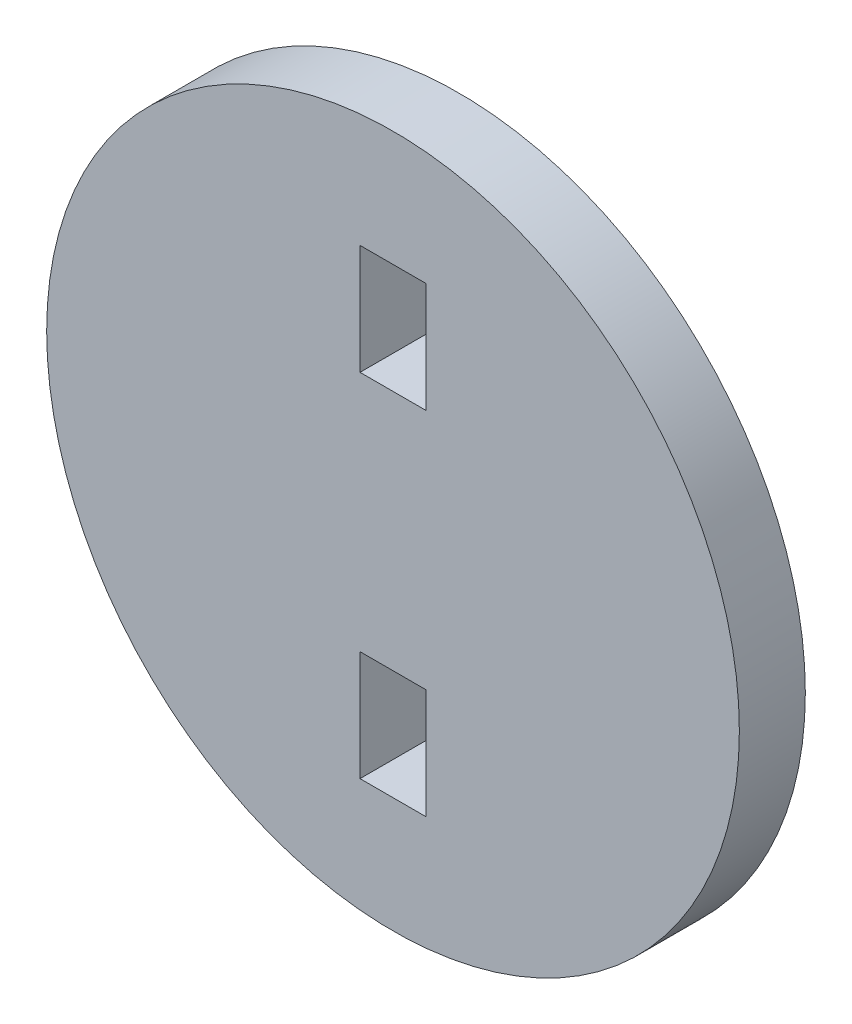
ISO-10303-21;
HEADER;
FILE_DESCRIPTION(('STEP AP214'),'2;1');
FILE_NAME('part.step','',(''),(''),'','','');
FILE_SCHEMA(('AUTOMOTIVE_DESIGN { 1 0 10303 214 1 1 1 1 }'));
ENDSEC;
DATA;
#1=APPLICATION_CONTEXT('core data for automotive mechanical design processes');
#2=APPLICATION_PROTOCOL_DEFINITION('international standard','automotive_design',2000,#1);
#3=PRODUCT_CONTEXT('',#1,'mechanical');
#4=PRODUCT('Part','Part','',(#3));
#5=PRODUCT_RELATED_PRODUCT_CATEGORY('part','',(#4));
#6=PRODUCT_DEFINITION_FORMATION('','',#4);
#7=PRODUCT_DEFINITION_CONTEXT('part definition',#1,'design');
#8=PRODUCT_DEFINITION('design','',#6,#7);
#9=PRODUCT_DEFINITION_SHAPE('','',#8);
#10=(LENGTH_UNIT() NAMED_UNIT(*) SI_UNIT(.MILLI.,.METRE.));
#11=(NAMED_UNIT(*) PLANE_ANGLE_UNIT() SI_UNIT($,.RADIAN.));
#12=(NAMED_UNIT(*) SI_UNIT($,.STERADIAN.) SOLID_ANGLE_UNIT());
#13=UNCERTAINTY_MEASURE_WITH_UNIT(LENGTH_MEASURE(1.E-05),#10,'distance_accuracy_value','');
#14=(GEOMETRIC_REPRESENTATION_CONTEXT(3) GLOBAL_UNCERTAINTY_ASSIGNED_CONTEXT((#13)) GLOBAL_UNIT_ASSIGNED_CONTEXT((#10,
#11,#12)) REPRESENTATION_CONTEXT('',''));
#15=CARTESIAN_POINT('',(0.,0.,0.));
#16=DIRECTION('',(0.,0.,1.));
#17=DIRECTION('',(1.,0.,0.));
#18=AXIS2_PLACEMENT_3D('',#15,#16,#17);
#19=CARTESIAN_POINT('',(0.,0.,3.));
#20=DIRECTION('',(0.,0.,1.));
#21=DIRECTION('',(1.,0.,0.));
#22=AXIS2_PLACEMENT_3D('',#19,#20,#21);
#23=PLANE('',#22);
#24=DIRECTION('',(1.,0.,0.));
#25=VECTOR('',#24,1.);
#26=CARTESIAN_POINT('',(-1.5,5.5,3.));
#27=LINE('',#26,#25);
#28=CARTESIAN_POINT('',(-1.5,5.5,3.));
#29=VERTEX_POINT('',#28);
#30=CARTESIAN_POINT('',(1.5,5.5,3.));
#31=VERTEX_POINT('',#30);
#32=EDGE_CURVE('E136',#29,#31,#27,.T.);
#33=ORIENTED_EDGE('',*,*,#32,.F.);
#34=DIRECTION('',(0.,-1.,0.));
#35=VECTOR('',#34,1.);
#36=CARTESIAN_POINT('',(-1.5,5.5,3.));
#37=LINE('',#36,#35);
#38=CARTESIAN_POINT('',(-1.5,10.5,3.));
#39=VERTEX_POINT('',#38);
#40=EDGE_CURVE('E134',#39,#29,#37,.T.);
#41=ORIENTED_EDGE('',*,*,#40,.F.);
#42=DIRECTION('',(-1.,0.,0.));
#43=VECTOR('',#42,1.);
#44=CARTESIAN_POINT('',(-1.5,10.5,3.));
#45=LINE('',#44,#43);
#46=CARTESIAN_POINT('',(1.5,10.5,3.));
#47=VERTEX_POINT('',#46);
#48=EDGE_CURVE('E142',#47,#39,#45,.T.);
#49=ORIENTED_EDGE('',*,*,#48,.F.);
#50=DIRECTION('',(0.,1.,0.));
#51=VECTOR('',#50,1.);
#52=CARTESIAN_POINT('',(1.5,5.5,3.));
#53=LINE('',#52,#51);
#54=EDGE_CURVE('E139',#31,#47,#53,.T.);
#55=ORIENTED_EDGE('',*,*,#54,.F.);
#56=EDGE_LOOP('',(#33,#41,#49,#55));
#57=FACE_BOUND('',#56,.T.);
#58=CARTESIAN_POINT('',(0.,0.,3.));
#59=DIRECTION('',(0.,0.,1.));
#60=DIRECTION('',(1.,0.,0.));
#61=AXIS2_PLACEMENT_3D('',#58,#59,#60);
#62=CIRCLE('',#61,15.75);
#63=CARTESIAN_POINT('',(15.75,0.,3.));
#64=VERTEX_POINT('',#63);
#65=EDGE_CURVE('E11',#64,#64,#62,.T.);
#66=ORIENTED_EDGE('',*,*,#65,.T.);
#67=EDGE_LOOP('',(#66));
#68=FACE_BOUND('',#67,.T.);
#69=DIRECTION('',(-1.,0.,0.));
#70=VECTOR('',#69,1.);
#71=CARTESIAN_POINT('',(1.5,-5.5,3.));
#72=LINE('',#71,#70);
#73=CARTESIAN_POINT('',(1.5,-5.5,3.));
#74=VERTEX_POINT('',#73);
#75=CARTESIAN_POINT('',(-1.5,-5.5,3.));
#76=VERTEX_POINT('',#75);
#77=EDGE_CURVE('E106',#74,#76,#72,.T.);
#78=ORIENTED_EDGE('',*,*,#77,.F.);
#79=DIRECTION('',(0.,1.,0.));
#80=VECTOR('',#79,1.);
#81=CARTESIAN_POINT('',(1.5,-5.5,3.));
#82=LINE('',#81,#80);
#83=CARTESIAN_POINT('',(1.5,-10.5,3.));
#84=VERTEX_POINT('',#83);
#85=EDGE_CURVE('E98',#84,#74,#82,.T.);
#86=ORIENTED_EDGE('',*,*,#85,.F.);
#87=DIRECTION('',(1.,0.,0.));
#88=VECTOR('',#87,1.);
#89=CARTESIAN_POINT('',(1.5,-10.5,3.));
#90=LINE('',#89,#88);
#91=CARTESIAN_POINT('',(-1.5,-10.5,3.));
#92=VERTEX_POINT('',#91);
#93=EDGE_CURVE('E120',#92,#84,#90,.T.);
#94=ORIENTED_EDGE('',*,*,#93,.F.);
#95=DIRECTION('',(0.,-1.,0.));
#96=VECTOR('',#95,1.);
#97=CARTESIAN_POINT('',(-1.5,-5.5,3.));
#98=LINE('',#97,#96);
#99=EDGE_CURVE('E118',#76,#92,#98,.T.);
#100=ORIENTED_EDGE('',*,*,#99,.F.);
#101=EDGE_LOOP('',(#78,#86,#94,#100));
#102=FACE_BOUND('',#101,.T.);
#103=ADVANCED_FACE('F33',(#57,#68,#102),#23,.T.);
#104=CARTESIAN_POINT('',(0.,0.,0.));
#105=DIRECTION('',(0.,0.,1.));
#106=DIRECTION('',(1.,0.,0.));
#107=AXIS2_PLACEMENT_3D('',#104,#105,#106);
#108=PLANE('',#107);
#109=DIRECTION('',(0.,-1.,0.));
#110=VECTOR('',#109,1.);
#111=CARTESIAN_POINT('',(-1.5,5.5,0.));
#112=LINE('',#111,#110);
#113=CARTESIAN_POINT('',(-1.5,10.5,0.));
#114=VERTEX_POINT('',#113);
#115=CARTESIAN_POINT('',(-1.5,5.5,0.));
#116=VERTEX_POINT('',#115);
#117=EDGE_CURVE('E114',#114,#116,#112,.T.);
#118=ORIENTED_EDGE('',*,*,#117,.T.);
#119=DIRECTION('',(1.,0.,0.));
#120=VECTOR('',#119,1.);
#121=CARTESIAN_POINT('',(-1.5,5.5,0.));
#122=LINE('',#121,#120);
#123=CARTESIAN_POINT('',(1.5,5.5,0.));
#124=VERTEX_POINT('',#123);
#125=EDGE_CURVE('E147',#116,#124,#122,.T.);
#126=ORIENTED_EDGE('',*,*,#125,.T.);
#127=DIRECTION('',(0.,1.,0.));
#128=VECTOR('',#127,1.);
#129=CARTESIAN_POINT('',(1.5,5.5,0.));
#130=LINE('',#129,#128);
#131=CARTESIAN_POINT('',(1.5,10.5,0.));
#132=VERTEX_POINT('',#131);
#133=EDGE_CURVE('E150',#124,#132,#130,.T.);
#134=ORIENTED_EDGE('',*,*,#133,.T.);
#135=DIRECTION('',(-1.,0.,0.));
#136=VECTOR('',#135,1.);
#137=CARTESIAN_POINT('',(-1.5,10.5,0.));
#138=LINE('',#137,#136);
#139=EDGE_CURVE('E137',#132,#114,#138,.T.);
#140=ORIENTED_EDGE('',*,*,#139,.T.);
#141=EDGE_LOOP('',(#118,#126,#134,#140));
#142=FACE_BOUND('',#141,.T.);
#143=CARTESIAN_POINT('',(0.,0.,0.));
#144=DIRECTION('',(0.,0.,1.));
#145=DIRECTION('',(1.,0.,0.));
#146=AXIS2_PLACEMENT_3D('',#143,#144,#145);
#147=CIRCLE('',#146,15.75);
#148=CARTESIAN_POINT('',(15.75,0.,0.));
#149=VERTEX_POINT('',#148);
#150=EDGE_CURVE('E37',#149,#149,#147,.T.);
#151=ORIENTED_EDGE('',*,*,#150,.F.);
#152=EDGE_LOOP('',(#151));
#153=FACE_BOUND('',#152,.T.);
#154=DIRECTION('',(0.,1.,0.));
#155=VECTOR('',#154,1.);
#156=CARTESIAN_POINT('',(1.5,-5.5,0.));
#157=LINE('',#156,#155);
#158=CARTESIAN_POINT('',(1.5,-10.5,0.));
#159=VERTEX_POINT('',#158);
#160=CARTESIAN_POINT('',(1.5,-5.5,0.));
#161=VERTEX_POINT('',#160);
#162=EDGE_CURVE('E56',#159,#161,#157,.T.);
#163=ORIENTED_EDGE('',*,*,#162,.T.);
#164=DIRECTION('',(-1.,0.,0.));
#165=VECTOR('',#164,1.);
#166=CARTESIAN_POINT('',(1.5,-5.5,0.));
#167=LINE('',#166,#165);
#168=CARTESIAN_POINT('',(-1.5,-5.5,0.));
#169=VERTEX_POINT('',#168);
#170=EDGE_CURVE('E113',#161,#169,#167,.T.);
#171=ORIENTED_EDGE('',*,*,#170,.T.);
#172=DIRECTION('',(0.,-1.,0.));
#173=VECTOR('',#172,1.);
#174=CARTESIAN_POINT('',(-1.5,-5.5,0.));
#175=LINE('',#174,#173);
#176=CARTESIAN_POINT('',(-1.5,-10.5,0.));
#177=VERTEX_POINT('',#176);
#178=EDGE_CURVE('E126',#169,#177,#175,.T.);
#179=ORIENTED_EDGE('',*,*,#178,.T.);
#180=DIRECTION('',(1.,0.,0.));
#181=VECTOR('',#180,1.);
#182=CARTESIAN_POINT('',(1.5,-10.5,0.));
#183=LINE('',#182,#181);
#184=EDGE_CURVE('E107',#177,#159,#183,.T.);
#185=ORIENTED_EDGE('',*,*,#184,.T.);
#186=EDGE_LOOP('',(#163,#171,#179,#185));
#187=FACE_BOUND('',#186,.T.);
#188=ADVANCED_FACE('F169',(#142,#153,#187),#108,.F.);
#189=CARTESIAN_POINT('',(0.,0.,3.));
#190=DIRECTION('',(0.,0.,-1.));
#191=DIRECTION('',(-1.,0.,0.));
#192=AXIS2_PLACEMENT_3D('',#189,#190,#191);
#193=CYLINDRICAL_SURFACE('',#192,15.75);
#194=ORIENTED_EDGE('',*,*,#65,.F.);
#195=EDGE_LOOP('',(#194));
#196=FACE_BOUND('',#195,.T.);
#197=ORIENTED_EDGE('',*,*,#150,.T.);
#198=EDGE_LOOP('',(#197));
#199=FACE_BOUND('',#198,.T.);
#200=ADVANCED_FACE('F35',(#196,#199),#193,.T.);
#201=CARTESIAN_POINT('',(-1.5,5.5,3.));
#202=DIRECTION('',(1.,0.,0.));
#203=DIRECTION('',(0.,1.,0.));
#204=AXIS2_PLACEMENT_3D('',#201,#202,#203);
#205=PLANE('',#204);
#206=ORIENTED_EDGE('',*,*,#117,.F.);
#207=DIRECTION('',(0.,0.,-1.));
#208=VECTOR('',#207,1.);
#209=CARTESIAN_POINT('',(-1.5,10.5,3.));
#210=LINE('',#209,#208);
#211=EDGE_CURVE('E144',#39,#114,#210,.T.);
#212=ORIENTED_EDGE('',*,*,#211,.F.);
#213=ORIENTED_EDGE('',*,*,#40,.T.);
#214=DIRECTION('',(0.,0.,-1.));
#215=VECTOR('',#214,1.);
#216=CARTESIAN_POINT('',(-1.5,5.5,3.));
#217=LINE('',#216,#215);
#218=EDGE_CURVE('E161',#29,#116,#217,.T.);
#219=ORIENTED_EDGE('',*,*,#218,.T.);
#220=EDGE_LOOP('',(#206,#212,#213,#219));
#221=FACE_BOUND('',#220,.T.);
#222=ADVANCED_FACE('F191',(#221),#205,.T.);
#223=CARTESIAN_POINT('',(-1.5,5.5,3.));
#224=DIRECTION('',(0.,1.,0.));
#225=DIRECTION('',(0.,0.,1.));
#226=AXIS2_PLACEMENT_3D('',#223,#224,#225);
#227=PLANE('',#226);
#228=ORIENTED_EDGE('',*,*,#125,.F.);
#229=ORIENTED_EDGE('',*,*,#218,.F.);
#230=ORIENTED_EDGE('',*,*,#32,.T.);
#231=DIRECTION('',(0.,0.,-1.));
#232=VECTOR('',#231,1.);
#233=CARTESIAN_POINT('',(1.5,5.5,3.));
#234=LINE('',#233,#232);
#235=EDGE_CURVE('E159',#31,#124,#234,.T.);
#236=ORIENTED_EDGE('',*,*,#235,.T.);
#237=EDGE_LOOP('',(#228,#229,#230,#236));
#238=FACE_BOUND('',#237,.T.);
#239=ADVANCED_FACE('F194',(#238),#227,.T.);
#240=CARTESIAN_POINT('',(1.5,5.5,3.));
#241=DIRECTION('',(-1.,0.,0.));
#242=DIRECTION('',(0.,0.,1.));
#243=AXIS2_PLACEMENT_3D('',#240,#241,#242);
#244=PLANE('',#243);
#245=ORIENTED_EDGE('',*,*,#133,.F.);
#246=ORIENTED_EDGE('',*,*,#235,.F.);
#247=ORIENTED_EDGE('',*,*,#54,.T.);
#248=DIRECTION('',(0.,0.,-1.));
#249=VECTOR('',#248,1.);
#250=CARTESIAN_POINT('',(1.5,10.5,3.));
#251=LINE('',#250,#249);
#252=EDGE_CURVE('E157',#47,#132,#251,.T.);
#253=ORIENTED_EDGE('',*,*,#252,.T.);
#254=EDGE_LOOP('',(#245,#246,#247,#253));
#255=FACE_BOUND('',#254,.T.);
#256=ADVANCED_FACE('F197',(#255),#244,.T.);
#257=CARTESIAN_POINT('',(-1.5,10.5,3.));
#258=DIRECTION('',(0.,-1.,0.));
#259=DIRECTION('',(0.,0.,-1.));
#260=AXIS2_PLACEMENT_3D('',#257,#258,#259);
#261=PLANE('',#260);
#262=ORIENTED_EDGE('',*,*,#139,.F.);
#263=ORIENTED_EDGE('',*,*,#252,.F.);
#264=ORIENTED_EDGE('',*,*,#48,.T.);
#265=ORIENTED_EDGE('',*,*,#211,.T.);
#266=EDGE_LOOP('',(#262,#263,#264,#265));
#267=FACE_BOUND('',#266,.T.);
#268=ADVANCED_FACE('F201',(#267),#261,.T.);
#269=CARTESIAN_POINT('',(1.5,-5.5,3.));
#270=DIRECTION('',(-1.,0.,0.));
#271=DIRECTION('',(0.,-1.,0.));
#272=AXIS2_PLACEMENT_3D('',#269,#270,#271);
#273=PLANE('',#272);
#274=ORIENTED_EDGE('',*,*,#162,.F.);
#275=DIRECTION('',(0.,0.,-1.));
#276=VECTOR('',#275,1.);
#277=CARTESIAN_POINT('',(1.5,-10.5,3.));
#278=LINE('',#277,#276);
#279=EDGE_CURVE('E102',#84,#159,#278,.T.);
#280=ORIENTED_EDGE('',*,*,#279,.F.);
#281=ORIENTED_EDGE('',*,*,#85,.T.);
#282=DIRECTION('',(0.,0.,-1.));
#283=VECTOR('',#282,1.);
#284=CARTESIAN_POINT('',(1.5,-5.5,3.));
#285=LINE('',#284,#283);
#286=EDGE_CURVE('E101',#74,#161,#285,.T.);
#287=ORIENTED_EDGE('',*,*,#286,.T.);
#288=EDGE_LOOP('',(#274,#280,#281,#287));
#289=FACE_BOUND('',#288,.T.);
#290=ADVANCED_FACE('F100',(#289),#273,.T.);
#291=CARTESIAN_POINT('',(1.5,-5.5,3.));
#292=DIRECTION('',(0.,-1.,0.));
#293=DIRECTION('',(1.,0.,0.));
#294=AXIS2_PLACEMENT_3D('',#291,#292,#293);
#295=PLANE('',#294);
#296=ORIENTED_EDGE('',*,*,#170,.F.);
#297=ORIENTED_EDGE('',*,*,#286,.F.);
#298=ORIENTED_EDGE('',*,*,#77,.T.);
#299=DIRECTION('',(0.,0.,-1.));
#300=VECTOR('',#299,1.);
#301=CARTESIAN_POINT('',(-1.5,-5.5,3.));
#302=LINE('',#301,#300);
#303=EDGE_CURVE('E115',#76,#169,#302,.T.);
#304=ORIENTED_EDGE('',*,*,#303,.T.);
#305=EDGE_LOOP('',(#296,#297,#298,#304));
#306=FACE_BOUND('',#305,.T.);
#307=ADVANCED_FACE('F110',(#306),#295,.T.);
#308=CARTESIAN_POINT('',(-1.5,-5.5,3.));
#309=DIRECTION('',(1.,0.,0.));
#310=DIRECTION('',(0.,1.,0.));
#311=AXIS2_PLACEMENT_3D('',#308,#309,#310);
#312=PLANE('',#311);
#313=ORIENTED_EDGE('',*,*,#178,.F.);
#314=ORIENTED_EDGE('',*,*,#303,.F.);
#315=ORIENTED_EDGE('',*,*,#99,.T.);
#316=DIRECTION('',(0.,0.,-1.));
#317=VECTOR('',#316,1.);
#318=CARTESIAN_POINT('',(-1.5,-10.5,3.));
#319=LINE('',#318,#317);
#320=EDGE_CURVE('E48',#92,#177,#319,.T.);
#321=ORIENTED_EDGE('',*,*,#320,.T.);
#322=EDGE_LOOP('',(#313,#314,#315,#321));
#323=FACE_BOUND('',#322,.T.);
#324=ADVANCED_FACE('F176',(#323),#312,.T.);
#325=CARTESIAN_POINT('',(1.5,-10.5,3.));
#326=DIRECTION('',(0.,1.,0.));
#327=DIRECTION('',(0.,0.,1.));
#328=AXIS2_PLACEMENT_3D('',#325,#326,#327);
#329=PLANE('',#328);
#330=ORIENTED_EDGE('',*,*,#184,.F.);
#331=ORIENTED_EDGE('',*,*,#320,.F.);
#332=ORIENTED_EDGE('',*,*,#93,.T.);
#333=ORIENTED_EDGE('',*,*,#279,.T.);
#334=EDGE_LOOP('',(#330,#331,#332,#333));
#335=FACE_BOUND('',#334,.T.);
#336=ADVANCED_FACE('F174',(#335),#329,.T.);
#337=CLOSED_SHELL('',(#103,#188,#200,#222,#239,#256,#268,#290,#307,#324,#336));
#338=MANIFOLD_SOLID_BREP('B2',#337);
#339=ADVANCED_BREP_SHAPE_REPRESENTATION('',(#18,#338),#14);
#340=SHAPE_DEFINITION_REPRESENTATION(#9,#339);
ENDSEC;
END-ISO-10303-21;
